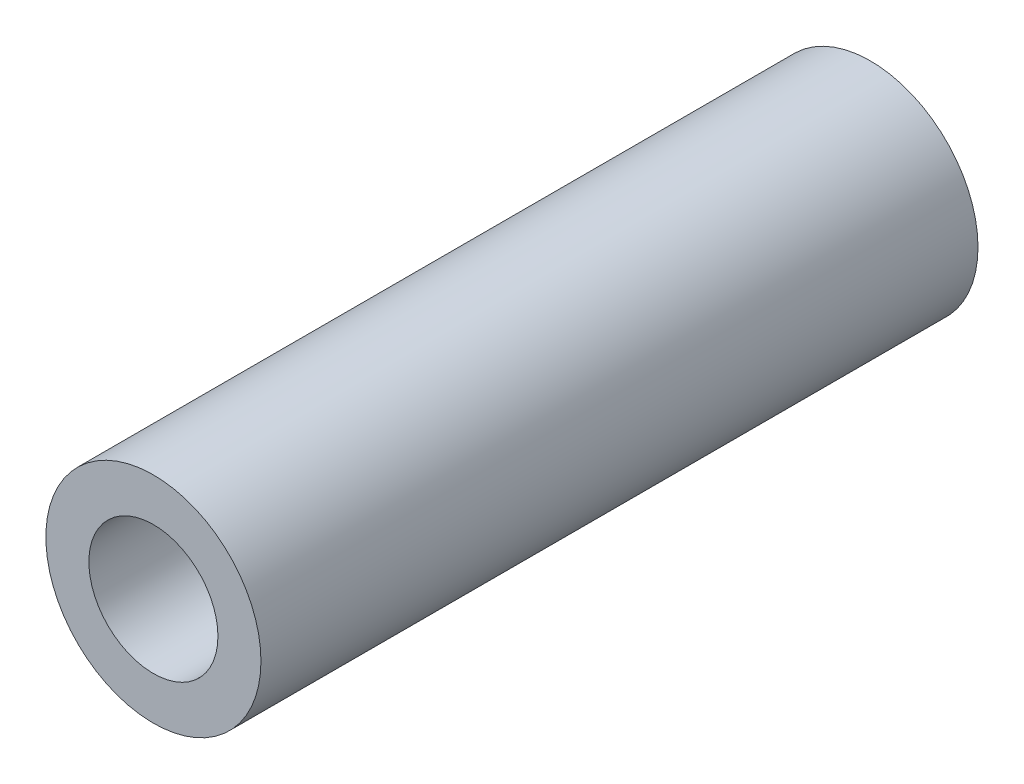
ISO-10303-21;
HEADER;
FILE_DESCRIPTION(('STEP AP214'),'2;1');
FILE_NAME('part.step','',(''),(''),'','','');
FILE_SCHEMA(('AUTOMOTIVE_DESIGN { 1 0 10303 214 1 1 1 1 }'));
ENDSEC;
DATA;
#1=APPLICATION_CONTEXT('core data for automotive mechanical design processes');
#2=APPLICATION_PROTOCOL_DEFINITION('international standard','automotive_design',2000,#1);
#3=PRODUCT_CONTEXT('',#1,'mechanical');
#4=PRODUCT('Part','Part','',(#3));
#5=PRODUCT_RELATED_PRODUCT_CATEGORY('part','',(#4));
#6=PRODUCT_DEFINITION_FORMATION('','',#4);
#7=PRODUCT_DEFINITION_CONTEXT('part definition',#1,'design');
#8=PRODUCT_DEFINITION('design','',#6,#7);
#9=PRODUCT_DEFINITION_SHAPE('','',#8);
#10=(LENGTH_UNIT() NAMED_UNIT(*) SI_UNIT(.MILLI.,.METRE.));
#11=(NAMED_UNIT(*) PLANE_ANGLE_UNIT() SI_UNIT($,.RADIAN.));
#12=(NAMED_UNIT(*) SI_UNIT($,.STERADIAN.) SOLID_ANGLE_UNIT());
#13=UNCERTAINTY_MEASURE_WITH_UNIT(LENGTH_MEASURE(1.E-05),#10,'distance_accuracy_value','');
#14=(GEOMETRIC_REPRESENTATION_CONTEXT(3) GLOBAL_UNCERTAINTY_ASSIGNED_CONTEXT((#13)) GLOBAL_UNIT_ASSIGNED_CONTEXT((#10,
#11,#12)) REPRESENTATION_CONTEXT('',''));
#15=CARTESIAN_POINT('',(0.,0.,0.));
#16=DIRECTION('',(0.,0.,1.));
#17=DIRECTION('',(1.,0.,0.));
#18=AXIS2_PLACEMENT_3D('',#15,#16,#17);
#19=CARTESIAN_POINT('',(0.,0.,50.));
#20=DIRECTION('',(0.,0.,1.));
#21=DIRECTION('',(1.,0.,0.));
#22=AXIS2_PLACEMENT_3D('',#19,#20,#21);
#23=PLANE('',#22);
#24=CARTESIAN_POINT('',(0.,0.,50.));
#25=DIRECTION('',(0.,0.,1.));
#26=DIRECTION('',(1.,0.,0.));
#27=AXIS2_PLACEMENT_3D('',#24,#25,#26);
#28=CIRCLE('',#27,7.5);
#29=CARTESIAN_POINT('',(7.5,0.,50.));
#30=VERTEX_POINT('',#29);
#31=EDGE_CURVE('E10',#30,#30,#28,.T.);
#32=ORIENTED_EDGE('',*,*,#31,.T.);
#33=EDGE_LOOP('',(#32));
#34=FACE_BOUND('',#33,.T.);
#35=CARTESIAN_POINT('',(0.,0.,50.));
#36=DIRECTION('',(0.,0.,1.));
#37=DIRECTION('',(1.,0.,0.));
#38=AXIS2_PLACEMENT_3D('',#35,#36,#37);
#39=CIRCLE('',#38,4.5);
#40=CARTESIAN_POINT('',(4.5,0.,50.));
#41=VERTEX_POINT('',#40);
#42=EDGE_CURVE('E50',#41,#41,#39,.T.);
#43=ORIENTED_EDGE('',*,*,#42,.F.);
#44=EDGE_LOOP('',(#43));
#45=FACE_BOUND('',#44,.T.);
#46=ADVANCED_FACE('F37',(#34,#45),#23,.T.);
#47=CARTESIAN_POINT('',(0.,0.,0.));
#48=DIRECTION('',(0.,0.,1.));
#49=DIRECTION('',(1.,0.,0.));
#50=AXIS2_PLACEMENT_3D('',#47,#48,#49);
#51=PLANE('',#50);
#52=CARTESIAN_POINT('',(0.,0.,0.));
#53=DIRECTION('',(0.,0.,1.));
#54=DIRECTION('',(1.,0.,0.));
#55=AXIS2_PLACEMENT_3D('',#52,#53,#54);
#56=CIRCLE('',#55,7.5);
#57=CARTESIAN_POINT('',(7.5,0.,0.));
#58=VERTEX_POINT('',#57);
#59=EDGE_CURVE('E41',#58,#58,#56,.T.);
#60=ORIENTED_EDGE('',*,*,#59,.F.);
#61=EDGE_LOOP('',(#60));
#62=FACE_BOUND('',#61,.T.);
#63=CARTESIAN_POINT('',(0.,0.,0.));
#64=DIRECTION('',(0.,0.,1.));
#65=DIRECTION('',(1.,0.,0.));
#66=AXIS2_PLACEMENT_3D('',#63,#64,#65);
#67=CIRCLE('',#66,4.5);
#68=CARTESIAN_POINT('',(4.5,0.,0.));
#69=VERTEX_POINT('',#68);
#70=EDGE_CURVE('E52',#69,#69,#67,.T.);
#71=ORIENTED_EDGE('',*,*,#70,.T.);
#72=EDGE_LOOP('',(#71));
#73=FACE_BOUND('',#72,.T.);
#74=ADVANCED_FACE('F64',(#62,#73),#51,.F.);
#75=CARTESIAN_POINT('',(0.,0.,50.));
#76=DIRECTION('',(0.,0.,-1.));
#77=DIRECTION('',(-1.,0.,0.));
#78=AXIS2_PLACEMENT_3D('',#75,#76,#77);
#79=CYLINDRICAL_SURFACE('',#78,7.5);
#80=ORIENTED_EDGE('',*,*,#31,.F.);
#81=EDGE_LOOP('',(#80));
#82=FACE_BOUND('',#81,.T.);
#83=ORIENTED_EDGE('',*,*,#59,.T.);
#84=EDGE_LOOP('',(#83));
#85=FACE_BOUND('',#84,.T.);
#86=ADVANCED_FACE('F39',(#82,#85),#79,.T.);
#87=CARTESIAN_POINT('',(0.,0.,50.));
#88=DIRECTION('',(0.,0.,-1.));
#89=DIRECTION('',(-1.,0.,0.));
#90=AXIS2_PLACEMENT_3D('',#87,#88,#89);
#91=CYLINDRICAL_SURFACE('',#90,4.5);
#92=ORIENTED_EDGE('',*,*,#42,.T.);
#93=EDGE_LOOP('',(#92));
#94=FACE_BOUND('',#93,.T.);
#95=ORIENTED_EDGE('',*,*,#70,.F.);
#96=EDGE_LOOP('',(#95));
#97=FACE_BOUND('',#96,.T.);
#98=ADVANCED_FACE('F60',(#94,#97),#91,.F.);
#99=CLOSED_SHELL('',(#46,#74,#86,#98));
#100=MANIFOLD_SOLID_BREP('B2',#99);
#101=ADVANCED_BREP_SHAPE_REPRESENTATION('',(#18,#100),#14);
#102=SHAPE_DEFINITION_REPRESENTATION(#9,#101);
ENDSEC;
END-ISO-10303-21;
